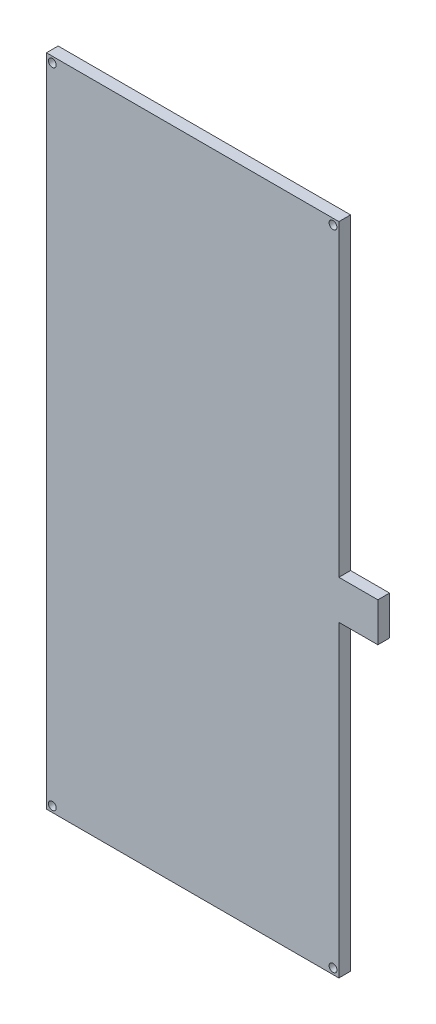
ISO-10303-21;
HEADER;
FILE_DESCRIPTION(('STEP AP214'),'2;1');
FILE_NAME('part.step','',(''),(''),'','','');
FILE_SCHEMA(('AUTOMOTIVE_DESIGN { 1 0 10303 214 1 1 1 1 }'));
ENDSEC;
DATA;
#1=APPLICATION_CONTEXT('core data for automotive mechanical design processes');
#2=APPLICATION_PROTOCOL_DEFINITION('international standard','automotive_design',2000,#1);
#3=PRODUCT_CONTEXT('',#1,'mechanical');
#4=PRODUCT('Part','Part','',(#3));
#5=PRODUCT_RELATED_PRODUCT_CATEGORY('part','',(#4));
#6=PRODUCT_DEFINITION_FORMATION('','',#4);
#7=PRODUCT_DEFINITION_CONTEXT('part definition',#1,'design');
#8=PRODUCT_DEFINITION('design','',#6,#7);
#9=PRODUCT_DEFINITION_SHAPE('','',#8);
#10=(LENGTH_UNIT() NAMED_UNIT(*) SI_UNIT(.MILLI.,.METRE.));
#11=(NAMED_UNIT(*) PLANE_ANGLE_UNIT() SI_UNIT($,.RADIAN.));
#12=(NAMED_UNIT(*) SI_UNIT($,.STERADIAN.) SOLID_ANGLE_UNIT());
#13=UNCERTAINTY_MEASURE_WITH_UNIT(LENGTH_MEASURE(1.E-05),#10,'distance_accuracy_value','');
#14=(GEOMETRIC_REPRESENTATION_CONTEXT(3) GLOBAL_UNCERTAINTY_ASSIGNED_CONTEXT((#13)) GLOBAL_UNIT_ASSIGNED_CONTEXT((#10,
#11,#12)) REPRESENTATION_CONTEXT('',''));
#15=CARTESIAN_POINT('',(0.,0.,0.));
#16=DIRECTION('',(0.,0.,1.));
#17=DIRECTION('',(1.,0.,0.));
#18=AXIS2_PLACEMENT_3D('',#15,#16,#17);
#19=CARTESIAN_POINT('',(37.5,-83.9999999999996,3.));
#20=DIRECTION('',(-1.,0.,0.));
#21=DIRECTION('',(0.,0.,1.));
#22=AXIS2_PLACEMENT_3D('',#19,#20,#21);
#23=PLANE('',#22);
#24=DIRECTION('',(0.,0.,1.));
#25=VECTOR('',#24,1.);
#26=CARTESIAN_POINT('',(37.5,5.,0.));
#27=LINE('',#26,#25);
#28=CARTESIAN_POINT('',(37.5,5.,0.));
#29=VERTEX_POINT('',#28);
#30=CARTESIAN_POINT('',(37.5,5.,3.));
#31=VERTEX_POINT('',#30);
#32=EDGE_CURVE('E129',#29,#31,#27,.T.);
#33=ORIENTED_EDGE('',*,*,#32,.F.);
#34=DIRECTION('',(0.,1.,0.));
#35=VECTOR('',#34,1.);
#36=CARTESIAN_POINT('',(37.5,-83.9999999999996,0.));
#37=LINE('',#36,#35);
#38=CARTESIAN_POINT('',(37.5,84.0000000000005,0.));
#39=VERTEX_POINT('',#38);
#40=EDGE_CURVE('E142',#29,#39,#37,.T.);
#41=ORIENTED_EDGE('',*,*,#40,.T.);
#42=DIRECTION('',(0.,0.,-1.));
#43=VECTOR('',#42,1.);
#44=CARTESIAN_POINT('',(37.5,84.0000000000005,3.));
#45=LINE('',#44,#43);
#46=CARTESIAN_POINT('',(37.5,84.0000000000005,3.));
#47=VERTEX_POINT('',#46);
#48=EDGE_CURVE('E11',#47,#39,#45,.T.);
#49=ORIENTED_EDGE('',*,*,#48,.F.);
#50=DIRECTION('',(0.,1.,0.));
#51=VECTOR('',#50,1.);
#52=CARTESIAN_POINT('',(37.5,-83.9999999999996,3.));
#53=LINE('',#52,#51);
#54=EDGE_CURVE('E96',#31,#47,#53,.T.);
#55=ORIENTED_EDGE('',*,*,#54,.F.);
#56=EDGE_LOOP('',(#33,#41,#49,#55));
#57=FACE_BOUND('',#56,.T.);
#58=ADVANCED_FACE('F43',(#57),#23,.F.);
#59=CARTESIAN_POINT('',(0.,0.,3.));
#60=DIRECTION('',(0.,0.,-1.));
#61=DIRECTION('',(-1.,0.,0.));
#62=AXIS2_PLACEMENT_3D('',#59,#60,#61);
#63=PLANE('',#62);
#64=CARTESIAN_POINT('',(-36.,-82.5000000000005,3.));
#65=DIRECTION('',(0.,0.,1.));
#66=DIRECTION('',(1.,0.,0.));
#67=AXIS2_PLACEMENT_3D('',#64,#65,#66);
#68=CIRCLE('',#67,0.999999999999998);
#69=CARTESIAN_POINT('',(-35.,-82.5000000000005,3.));
#70=VERTEX_POINT('',#69);
#71=EDGE_CURVE('E176',#70,#70,#68,.T.);
#72=ORIENTED_EDGE('',*,*,#71,.F.);
#73=EDGE_LOOP('',(#72));
#74=FACE_BOUND('',#73,.T.);
#75=CARTESIAN_POINT('',(36.,82.5000000000005,3.));
#76=DIRECTION('',(0.,0.,1.));
#77=DIRECTION('',(1.,0.,0.));
#78=AXIS2_PLACEMENT_3D('',#75,#76,#77);
#79=CIRCLE('',#78,0.999999999999998);
#80=CARTESIAN_POINT('',(37.,82.5000000000005,3.));
#81=VERTEX_POINT('',#80);
#82=EDGE_CURVE('E171',#81,#81,#79,.T.);
#83=ORIENTED_EDGE('',*,*,#82,.F.);
#84=EDGE_LOOP('',(#83));
#85=FACE_BOUND('',#84,.T.);
#86=CARTESIAN_POINT('',(37.5,-83.9999999999996,3.));
#87=VERTEX_POINT('',#86);
#88=CARTESIAN_POINT('',(37.5,-4.99999999999999,3.));
#89=VERTEX_POINT('',#88);
#90=EDGE_CURVE('E198',#87,#89,#53,.T.);
#91=ORIENTED_EDGE('',*,*,#90,.T.);
#92=DIRECTION('',(1.,0.,0.));
#93=VECTOR('',#92,1.);
#94=CARTESIAN_POINT('',(37.5,-5.,3.));
#95=LINE('',#94,#93);
#96=CARTESIAN_POINT('',(47.5,-5.,3.));
#97=VERTEX_POINT('',#96);
#98=EDGE_CURVE('E59',#89,#97,#95,.T.);
#99=ORIENTED_EDGE('',*,*,#98,.T.);
#100=DIRECTION('',(0.,1.,0.));
#101=VECTOR('',#100,1.);
#102=CARTESIAN_POINT('',(47.5,5.,3.));
#103=LINE('',#102,#101);
#104=CARTESIAN_POINT('',(47.5,5.,3.));
#105=VERTEX_POINT('',#104);
#106=EDGE_CURVE('E154',#97,#105,#103,.T.);
#107=ORIENTED_EDGE('',*,*,#106,.T.);
#108=DIRECTION('',(-1.,0.,0.));
#109=VECTOR('',#108,1.);
#110=CARTESIAN_POINT('',(37.5,5.,3.));
#111=LINE('',#110,#109);
#112=EDGE_CURVE('E123',#105,#31,#111,.T.);
#113=ORIENTED_EDGE('',*,*,#112,.T.);
#114=ORIENTED_EDGE('',*,*,#54,.T.);
#115=DIRECTION('',(-1.,0.,0.));
#116=VECTOR('',#115,1.);
#117=CARTESIAN_POINT('',(-37.5,84.0000000000005,3.));
#118=LINE('',#117,#116);
#119=CARTESIAN_POINT('',(-37.5,84.0000000000005,3.));
#120=VERTEX_POINT('',#119);
#121=EDGE_CURVE('E201',#47,#120,#118,.T.);
#122=ORIENTED_EDGE('',*,*,#121,.T.);
#123=DIRECTION('',(0.,-1.,0.));
#124=VECTOR('',#123,1.);
#125=CARTESIAN_POINT('',(-37.5,-83.9999999999996,3.));
#126=LINE('',#125,#124);
#127=CARTESIAN_POINT('',(-37.5,-83.9999999999996,3.));
#128=VERTEX_POINT('',#127);
#129=EDGE_CURVE('E204',#120,#128,#126,.T.);
#130=ORIENTED_EDGE('',*,*,#129,.T.);
#131=DIRECTION('',(1.,0.,0.));
#132=VECTOR('',#131,1.);
#133=CARTESIAN_POINT('',(-37.5,-83.9999999999996,3.));
#134=LINE('',#133,#132);
#135=EDGE_CURVE('E68',#128,#87,#134,.T.);
#136=ORIENTED_EDGE('',*,*,#135,.T.);
#137=EDGE_LOOP('',(#91,#99,#107,#113,#114,#122,#130,#136));
#138=FACE_BOUND('',#137,.T.);
#139=CARTESIAN_POINT('',(-36.,82.5000000000005,3.));
#140=DIRECTION('',(0.,0.,-1.));
#141=DIRECTION('',(-1.,0.,0.));
#142=AXIS2_PLACEMENT_3D('',#139,#140,#141);
#143=CIRCLE('',#142,0.999999999999998);
#144=CARTESIAN_POINT('',(-37.,82.5000000000005,3.));
#145=VERTEX_POINT('',#144);
#146=EDGE_CURVE('E167',#145,#145,#143,.T.);
#147=ORIENTED_EDGE('',*,*,#146,.T.);
#148=EDGE_LOOP('',(#147));
#149=FACE_BOUND('',#148,.T.);
#150=CARTESIAN_POINT('',(36.,-82.5000000000005,3.));
#151=DIRECTION('',(0.,0.,-1.));
#152=DIRECTION('',(-1.,0.,0.));
#153=AXIS2_PLACEMENT_3D('',#150,#151,#152);
#154=CIRCLE('',#153,0.999999999999998);
#155=CARTESIAN_POINT('',(35.,-82.5000000000005,3.));
#156=VERTEX_POINT('',#155);
#157=EDGE_CURVE('E184',#156,#156,#154,.T.);
#158=ORIENTED_EDGE('',*,*,#157,.T.);
#159=EDGE_LOOP('',(#158));
#160=FACE_BOUND('',#159,.T.);
#161=ADVANCED_FACE('F252',(#74,#85,#138,#149,#160),#63,.F.);
#162=CARTESIAN_POINT('',(0.,0.,0.));
#163=DIRECTION('',(0.,0.,-1.));
#164=DIRECTION('',(-1.,0.,0.));
#165=AXIS2_PLACEMENT_3D('',#162,#163,#164);
#166=PLANE('',#165);
#167=CARTESIAN_POINT('',(-36.,82.5000000000005,0.));
#168=DIRECTION('',(0.,0.,-1.));
#169=DIRECTION('',(-1.,0.,0.));
#170=AXIS2_PLACEMENT_3D('',#167,#168,#169);
#171=CIRCLE('',#170,0.999999999999998);
#172=CARTESIAN_POINT('',(-37.,82.5000000000005,0.));
#173=VERTEX_POINT('',#172);
#174=EDGE_CURVE('E172',#173,#173,#171,.T.);
#175=ORIENTED_EDGE('',*,*,#174,.F.);
#176=EDGE_LOOP('',(#175));
#177=FACE_BOUND('',#176,.T.);
#178=CARTESIAN_POINT('',(36.,82.5000000000005,0.));
#179=DIRECTION('',(0.,0.,1.));
#180=DIRECTION('',(1.,0.,0.));
#181=AXIS2_PLACEMENT_3D('',#178,#179,#180);
#182=CIRCLE('',#181,0.999999999999998);
#183=CARTESIAN_POINT('',(37.,82.5000000000005,0.));
#184=VERTEX_POINT('',#183);
#185=EDGE_CURVE('E191',#184,#184,#182,.T.);
#186=ORIENTED_EDGE('',*,*,#185,.T.);
#187=EDGE_LOOP('',(#186));
#188=FACE_BOUND('',#187,.T.);
#189=CARTESIAN_POINT('',(37.5,-83.9999999999996,0.));
#190=VERTEX_POINT('',#189);
#191=CARTESIAN_POINT('',(37.5,-5.,0.));
#192=VERTEX_POINT('',#191);
#193=EDGE_CURVE('E210',#190,#192,#37,.T.);
#194=ORIENTED_EDGE('',*,*,#193,.F.);
#195=DIRECTION('',(1.,0.,0.));
#196=VECTOR('',#195,1.);
#197=CARTESIAN_POINT('',(-37.5,-83.9999999999996,0.));
#198=LINE('',#197,#196);
#199=CARTESIAN_POINT('',(-37.5,-83.9999999999996,0.));
#200=VERTEX_POINT('',#199);
#201=EDGE_CURVE('E89',#200,#190,#198,.T.);
#202=ORIENTED_EDGE('',*,*,#201,.F.);
#203=DIRECTION('',(0.,-1.,0.));
#204=VECTOR('',#203,1.);
#205=CARTESIAN_POINT('',(-37.5,-83.9999999999996,0.));
#206=LINE('',#205,#204);
#207=CARTESIAN_POINT('',(-37.5,84.0000000000005,0.));
#208=VERTEX_POINT('',#207);
#209=EDGE_CURVE('E217',#208,#200,#206,.T.);
#210=ORIENTED_EDGE('',*,*,#209,.F.);
#211=DIRECTION('',(-1.,0.,0.));
#212=VECTOR('',#211,1.);
#213=CARTESIAN_POINT('',(-37.5,84.0000000000005,0.));
#214=LINE('',#213,#212);
#215=EDGE_CURVE('E214',#39,#208,#214,.T.);
#216=ORIENTED_EDGE('',*,*,#215,.F.);
#217=ORIENTED_EDGE('',*,*,#40,.F.);
#218=DIRECTION('',(-1.,0.,0.));
#219=VECTOR('',#218,1.);
#220=CARTESIAN_POINT('',(37.5,5.,0.));
#221=LINE('',#220,#219);
#222=CARTESIAN_POINT('',(47.5,5.,0.));
#223=VERTEX_POINT('',#222);
#224=EDGE_CURVE('E121',#223,#29,#221,.T.);
#225=ORIENTED_EDGE('',*,*,#224,.F.);
#226=DIRECTION('',(0.,1.,0.));
#227=VECTOR('',#226,1.);
#228=CARTESIAN_POINT('',(47.5,5.,0.));
#229=LINE('',#228,#227);
#230=CARTESIAN_POINT('',(47.5,-5.,0.));
#231=VERTEX_POINT('',#230);
#232=EDGE_CURVE('E139',#231,#223,#229,.T.);
#233=ORIENTED_EDGE('',*,*,#232,.F.);
#234=DIRECTION('',(1.,0.,0.));
#235=VECTOR('',#234,1.);
#236=CARTESIAN_POINT('',(37.5,-5.,0.));
#237=LINE('',#236,#235);
#238=EDGE_CURVE('E130',#192,#231,#237,.T.);
#239=ORIENTED_EDGE('',*,*,#238,.F.);
#240=EDGE_LOOP('',(#194,#202,#210,#216,#217,#225,#233,#239));
#241=FACE_BOUND('',#240,.T.);
#242=CARTESIAN_POINT('',(-36.,-82.5000000000005,0.));
#243=DIRECTION('',(0.,0.,1.));
#244=DIRECTION('',(1.,0.,0.));
#245=AXIS2_PLACEMENT_3D('',#242,#243,#244);
#246=CIRCLE('',#245,0.999999999999998);
#247=CARTESIAN_POINT('',(-35.,-82.5000000000005,0.));
#248=VERTEX_POINT('',#247);
#249=EDGE_CURVE('E180',#248,#248,#246,.T.);
#250=ORIENTED_EDGE('',*,*,#249,.T.);
#251=EDGE_LOOP('',(#250));
#252=FACE_BOUND('',#251,.T.);
#253=CARTESIAN_POINT('',(36.,-82.5000000000005,0.));
#254=DIRECTION('',(0.,0.,-1.));
#255=DIRECTION('',(-1.,0.,0.));
#256=AXIS2_PLACEMENT_3D('',#253,#254,#255);
#257=CIRCLE('',#256,0.999999999999998);
#258=CARTESIAN_POINT('',(35.,-82.5000000000005,0.));
#259=VERTEX_POINT('',#258);
#260=EDGE_CURVE('E161',#259,#259,#257,.T.);
#261=ORIENTED_EDGE('',*,*,#260,.F.);
#262=EDGE_LOOP('',(#261));
#263=FACE_BOUND('',#262,.T.);
#264=ADVANCED_FACE('F136',(#177,#188,#241,#252,#263),#166,.T.);
#265=ORIENTED_EDGE('',*,*,#193,.T.);
#266=DIRECTION('',(0.,0.,1.));
#267=VECTOR('',#266,1.);
#268=CARTESIAN_POINT('',(37.5,-5.,0.));
#269=LINE('',#268,#267);
#270=EDGE_CURVE('E162',#192,#89,#269,.T.);
#271=ORIENTED_EDGE('',*,*,#270,.T.);
#272=ORIENTED_EDGE('',*,*,#90,.F.);
#273=DIRECTION('',(0.,0.,-1.));
#274=VECTOR('',#273,1.);
#275=CARTESIAN_POINT('',(37.5,-83.9999999999996,3.));
#276=LINE('',#275,#274);
#277=EDGE_CURVE('E209',#87,#190,#276,.T.);
#278=ORIENTED_EDGE('',*,*,#277,.T.);
#279=EDGE_LOOP('',(#265,#271,#272,#278));
#280=FACE_BOUND('',#279,.T.);
#281=ADVANCED_FACE('F45',(#280),#23,.F.);
#282=CARTESIAN_POINT('',(-37.5,84.0000000000005,3.));
#283=DIRECTION('',(0.,-1.,0.));
#284=DIRECTION('',(0.,0.,-1.));
#285=AXIS2_PLACEMENT_3D('',#282,#283,#284);
#286=PLANE('',#285);
#287=ORIENTED_EDGE('',*,*,#215,.T.);
#288=DIRECTION('',(0.,0.,-1.));
#289=VECTOR('',#288,1.);
#290=CARTESIAN_POINT('',(-37.5,84.0000000000005,3.));
#291=LINE('',#290,#289);
#292=EDGE_CURVE('E52',#120,#208,#291,.T.);
#293=ORIENTED_EDGE('',*,*,#292,.F.);
#294=ORIENTED_EDGE('',*,*,#121,.F.);
#295=ORIENTED_EDGE('',*,*,#48,.T.);
#296=EDGE_LOOP('',(#287,#293,#294,#295));
#297=FACE_BOUND('',#296,.T.);
#298=ADVANCED_FACE('F248',(#297),#286,.F.);
#299=CARTESIAN_POINT('',(-37.5,-83.9999999999996,3.));
#300=DIRECTION('',(1.,0.,0.));
#301=DIRECTION('',(0.,0.,-1.));
#302=AXIS2_PLACEMENT_3D('',#299,#300,#301);
#303=PLANE('',#302);
#304=ORIENTED_EDGE('',*,*,#209,.T.);
#305=DIRECTION('',(0.,0.,-1.));
#306=VECTOR('',#305,1.);
#307=CARTESIAN_POINT('',(-37.5,-83.9999999999996,3.));
#308=LINE('',#307,#306);
#309=EDGE_CURVE('E224',#128,#200,#308,.T.);
#310=ORIENTED_EDGE('',*,*,#309,.F.);
#311=ORIENTED_EDGE('',*,*,#129,.F.);
#312=ORIENTED_EDGE('',*,*,#292,.T.);
#313=EDGE_LOOP('',(#304,#310,#311,#312));
#314=FACE_BOUND('',#313,.T.);
#315=ADVANCED_FACE('F232',(#314),#303,.F.);
#316=CARTESIAN_POINT('',(-37.5,-83.9999999999996,3.));
#317=DIRECTION('',(0.,1.,0.));
#318=DIRECTION('',(0.,0.,1.));
#319=AXIS2_PLACEMENT_3D('',#316,#317,#318);
#320=PLANE('',#319);
#321=ORIENTED_EDGE('',*,*,#201,.T.);
#322=ORIENTED_EDGE('',*,*,#277,.F.);
#323=ORIENTED_EDGE('',*,*,#135,.F.);
#324=ORIENTED_EDGE('',*,*,#309,.T.);
#325=EDGE_LOOP('',(#321,#322,#323,#324));
#326=FACE_BOUND('',#325,.T.);
#327=ADVANCED_FACE('F237',(#326),#320,.F.);
#328=CARTESIAN_POINT('',(36.,82.5000000000005,0.));
#329=DIRECTION('',(0.,0.,1.));
#330=DIRECTION('',(1.,0.,0.));
#331=AXIS2_PLACEMENT_3D('',#328,#329,#330);
#332=CYLINDRICAL_SURFACE('',#331,0.999999999999998);
#333=ORIENTED_EDGE('',*,*,#185,.F.);
#334=EDGE_LOOP('',(#333));
#335=FACE_BOUND('',#334,.T.);
#336=ORIENTED_EDGE('',*,*,#82,.T.);
#337=EDGE_LOOP('',(#336));
#338=FACE_BOUND('',#337,.T.);
#339=ADVANCED_FACE('F239',(#335,#338),#332,.F.);
#340=CARTESIAN_POINT('',(-36.,82.5000000000005,0.));
#341=DIRECTION('',(0.,0.,1.));
#342=DIRECTION('',(1.,0.,0.));
#343=AXIS2_PLACEMENT_3D('',#340,#341,#342);
#344=CYLINDRICAL_SURFACE('',#343,0.999999999999998);
#345=ORIENTED_EDGE('',*,*,#174,.T.);
#346=EDGE_LOOP('',(#345));
#347=FACE_BOUND('',#346,.T.);
#348=ORIENTED_EDGE('',*,*,#146,.F.);
#349=EDGE_LOOP('',(#348));
#350=FACE_BOUND('',#349,.T.);
#351=ADVANCED_FACE('F245',(#347,#350),#344,.F.);
#352=CARTESIAN_POINT('',(-36.,-82.5000000000005,0.));
#353=DIRECTION('',(0.,0.,1.));
#354=DIRECTION('',(1.,0.,0.));
#355=AXIS2_PLACEMENT_3D('',#352,#353,#354);
#356=CYLINDRICAL_SURFACE('',#355,0.999999999999998);
#357=ORIENTED_EDGE('',*,*,#249,.F.);
#358=EDGE_LOOP('',(#357));
#359=FACE_BOUND('',#358,.T.);
#360=ORIENTED_EDGE('',*,*,#71,.T.);
#361=EDGE_LOOP('',(#360));
#362=FACE_BOUND('',#361,.T.);
#363=ADVANCED_FACE('F273',(#359,#362),#356,.F.);
#364=CARTESIAN_POINT('',(36.,-82.5000000000005,0.));
#365=DIRECTION('',(0.,0.,1.));
#366=DIRECTION('',(1.,0.,0.));
#367=AXIS2_PLACEMENT_3D('',#364,#365,#366);
#368=CYLINDRICAL_SURFACE('',#367,0.999999999999998);
#369=ORIENTED_EDGE('',*,*,#260,.T.);
#370=EDGE_LOOP('',(#369));
#371=FACE_BOUND('',#370,.T.);
#372=ORIENTED_EDGE('',*,*,#157,.F.);
#373=EDGE_LOOP('',(#372));
#374=FACE_BOUND('',#373,.T.);
#375=ADVANCED_FACE('F270',(#371,#374),#368,.F.);
#376=CARTESIAN_POINT('',(47.5,5.,0.));
#377=DIRECTION('',(1.,0.,0.));
#378=DIRECTION('',(0.,0.,-1.));
#379=AXIS2_PLACEMENT_3D('',#376,#377,#378);
#380=PLANE('',#379);
#381=ORIENTED_EDGE('',*,*,#106,.F.);
#382=DIRECTION('',(0.,0.,1.));
#383=VECTOR('',#382,1.);
#384=CARTESIAN_POINT('',(47.5,-5.,0.));
#385=LINE('',#384,#383);
#386=EDGE_CURVE('E146',#231,#97,#385,.T.);
#387=ORIENTED_EDGE('',*,*,#386,.F.);
#388=ORIENTED_EDGE('',*,*,#232,.T.);
#389=DIRECTION('',(0.,0.,1.));
#390=VECTOR('',#389,1.);
#391=CARTESIAN_POINT('',(47.5,5.,0.));
#392=LINE('',#391,#390);
#393=EDGE_CURVE('E118',#223,#105,#392,.T.);
#394=ORIENTED_EDGE('',*,*,#393,.T.);
#395=EDGE_LOOP('',(#381,#387,#388,#394));
#396=FACE_BOUND('',#395,.T.);
#397=ADVANCED_FACE('F145',(#396),#380,.T.);
#398=CARTESIAN_POINT('',(37.5,-5.,0.));
#399=DIRECTION('',(0.,-1.,0.));
#400=DIRECTION('',(0.,0.,-1.));
#401=AXIS2_PLACEMENT_3D('',#398,#399,#400);
#402=PLANE('',#401);
#403=ORIENTED_EDGE('',*,*,#98,.F.);
#404=ORIENTED_EDGE('',*,*,#270,.F.);
#405=ORIENTED_EDGE('',*,*,#238,.T.);
#406=ORIENTED_EDGE('',*,*,#386,.T.);
#407=EDGE_LOOP('',(#403,#404,#405,#406));
#408=FACE_BOUND('',#407,.T.);
#409=ADVANCED_FACE('F283',(#408),#402,.T.);
#410=CARTESIAN_POINT('',(37.5,5.,0.));
#411=DIRECTION('',(0.,1.,0.));
#412=DIRECTION('',(0.,0.,1.));
#413=AXIS2_PLACEMENT_3D('',#410,#411,#412);
#414=PLANE('',#413);
#415=ORIENTED_EDGE('',*,*,#112,.F.);
#416=ORIENTED_EDGE('',*,*,#393,.F.);
#417=ORIENTED_EDGE('',*,*,#224,.T.);
#418=ORIENTED_EDGE('',*,*,#32,.T.);
#419=EDGE_LOOP('',(#415,#416,#417,#418));
#420=FACE_BOUND('',#419,.T.);
#421=ADVANCED_FACE('F120',(#420),#414,.T.);
#422=CLOSED_SHELL('',(#58,#161,#264,#281,#298,#315,#327,#339,#351,#363,#375,#397,#409,#421));
#423=MANIFOLD_SOLID_BREP('B2',#422);
#424=ADVANCED_BREP_SHAPE_REPRESENTATION('',(#18,#423),#14);
#425=SHAPE_DEFINITION_REPRESENTATION(#9,#424);
ENDSEC;
END-ISO-10303-21;
